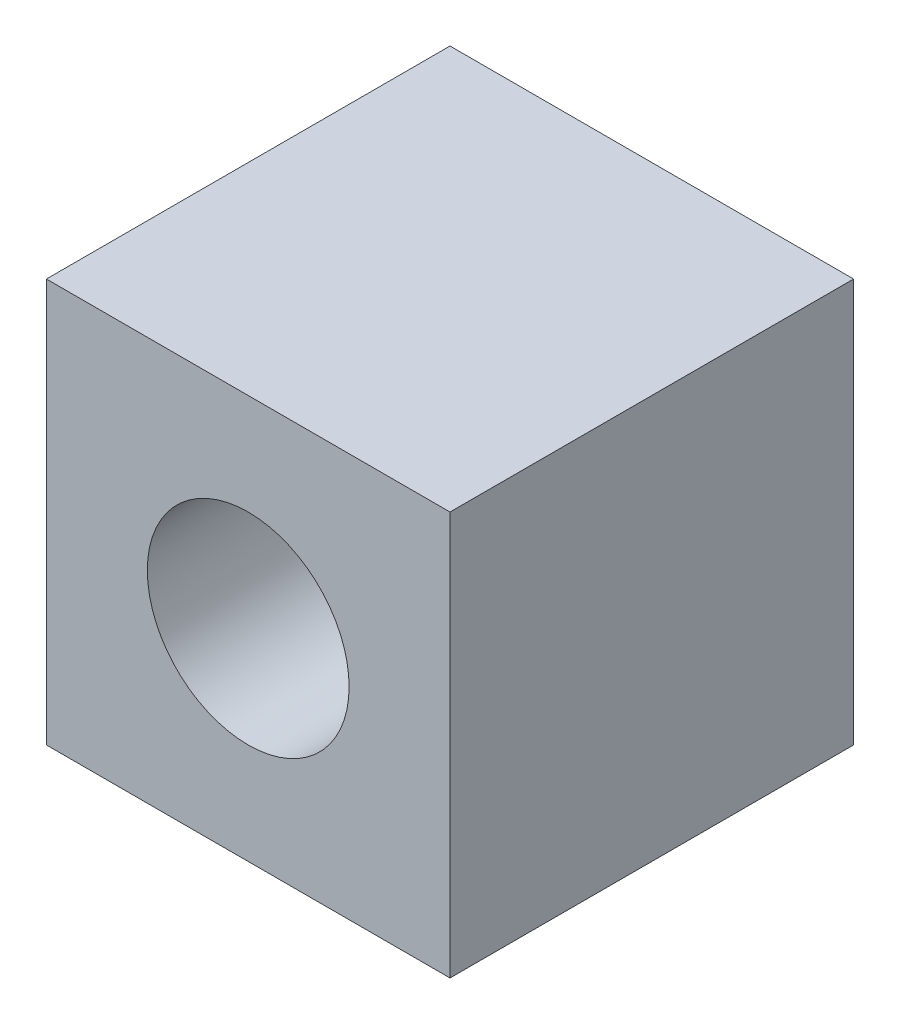
ISO-10303-21;
HEADER;
FILE_DESCRIPTION(('STEP AP214'),'2;1');
FILE_NAME('part.step','',(''),(''),'','','');
FILE_SCHEMA(('AUTOMOTIVE_DESIGN { 1 0 10303 214 1 1 1 1 }'));
ENDSEC;
DATA;
#1=APPLICATION_CONTEXT('core data for automotive mechanical design processes');
#2=APPLICATION_PROTOCOL_DEFINITION('international standard','automotive_design',2000,#1);
#3=PRODUCT_CONTEXT('',#1,'mechanical');
#4=PRODUCT('Part','Part','',(#3));
#5=PRODUCT_RELATED_PRODUCT_CATEGORY('part','',(#4));
#6=PRODUCT_DEFINITION_FORMATION('','',#4);
#7=PRODUCT_DEFINITION_CONTEXT('part definition',#1,'design');
#8=PRODUCT_DEFINITION('design','',#6,#7);
#9=PRODUCT_DEFINITION_SHAPE('','',#8);
#10=(LENGTH_UNIT() NAMED_UNIT(*) SI_UNIT(.MILLI.,.METRE.));
#11=(NAMED_UNIT(*) PLANE_ANGLE_UNIT() SI_UNIT($,.RADIAN.));
#12=(NAMED_UNIT(*) SI_UNIT($,.STERADIAN.) SOLID_ANGLE_UNIT());
#13=UNCERTAINTY_MEASURE_WITH_UNIT(LENGTH_MEASURE(1.E-05),#10,'distance_accuracy_value','');
#14=(GEOMETRIC_REPRESENTATION_CONTEXT(3) GLOBAL_UNCERTAINTY_ASSIGNED_CONTEXT((#13)) GLOBAL_UNIT_ASSIGNED_CONTEXT((#10,
#11,#12)) REPRESENTATION_CONTEXT('',''));
#15=CARTESIAN_POINT('',(0.,0.,0.));
#16=DIRECTION('',(0.,0.,1.));
#17=DIRECTION('',(1.,0.,0.));
#18=AXIS2_PLACEMENT_3D('',#15,#16,#17);
#19=CARTESIAN_POINT('',(-50.,100.,50.));
#20=DIRECTION('',(1.,0.,0.));
#21=DIRECTION('',(0.,0.,-1.));
#22=AXIS2_PLACEMENT_3D('',#19,#20,#21);
#23=PLANE('',#22);
#24=DIRECTION('',(0.,0.,1.));
#25=VECTOR('',#24,1.);
#26=CARTESIAN_POINT('',(-50.,0.,50.));
#27=LINE('',#26,#25);
#28=CARTESIAN_POINT('',(-50.,0.,-50.));
#29=VERTEX_POINT('',#28);
#30=CARTESIAN_POINT('',(-50.,0.,50.));
#31=VERTEX_POINT('',#30);
#32=EDGE_CURVE('E109',#29,#31,#27,.T.);
#33=ORIENTED_EDGE('',*,*,#32,.T.);
#34=DIRECTION('',(0.,-1.,0.));
#35=VECTOR('',#34,1.);
#36=CARTESIAN_POINT('',(-50.,100.,50.));
#37=LINE('',#36,#35);
#38=CARTESIAN_POINT('',(-50.,100.,50.));
#39=VERTEX_POINT('',#38);
#40=EDGE_CURVE('E11',#39,#31,#37,.T.);
#41=ORIENTED_EDGE('',*,*,#40,.F.);
#42=DIRECTION('',(0.,0.,1.));
#43=VECTOR('',#42,1.);
#44=CARTESIAN_POINT('',(-50.,100.,50.));
#45=LINE('',#44,#43);
#46=CARTESIAN_POINT('',(-50.,100.,-50.));
#47=VERTEX_POINT('',#46);
#48=EDGE_CURVE('E93',#47,#39,#45,.T.);
#49=ORIENTED_EDGE('',*,*,#48,.F.);
#50=DIRECTION('',(0.,-1.,0.));
#51=VECTOR('',#50,1.);
#52=CARTESIAN_POINT('',(-50.,100.,-50.));
#53=LINE('',#52,#51);
#54=EDGE_CURVE('E105',#47,#29,#53,.T.);
#55=ORIENTED_EDGE('',*,*,#54,.T.);
#56=EDGE_LOOP('',(#33,#41,#49,#55));
#57=FACE_BOUND('',#56,.T.);
#58=ADVANCED_FACE('F41',(#57),#23,.F.);
#59=CARTESIAN_POINT('',(50.,100.,50.));
#60=DIRECTION('',(0.,0.,-1.));
#61=DIRECTION('',(-1.,0.,0.));
#62=AXIS2_PLACEMENT_3D('',#59,#60,#61);
#63=PLANE('',#62);
#64=CARTESIAN_POINT('',(0.,50.,50.));
#65=DIRECTION('',(0.,0.,1.));
#66=DIRECTION('',(1.,0.,0.));
#67=AXIS2_PLACEMENT_3D('',#64,#65,#66);
#68=CIRCLE('',#67,25.);
#69=CARTESIAN_POINT('',(25.,50.,50.));
#70=VERTEX_POINT('',#69);
#71=EDGE_CURVE('E130',#70,#70,#68,.T.);
#72=ORIENTED_EDGE('',*,*,#71,.F.);
#73=EDGE_LOOP('',(#72));
#74=FACE_BOUND('',#73,.T.);
#75=DIRECTION('',(1.,0.,0.));
#76=VECTOR('',#75,1.);
#77=CARTESIAN_POINT('',(50.,0.,50.));
#78=LINE('',#77,#76);
#79=CARTESIAN_POINT('',(50.,0.,50.));
#80=VERTEX_POINT('',#79);
#81=EDGE_CURVE('E98',#31,#80,#78,.T.);
#82=ORIENTED_EDGE('',*,*,#81,.T.);
#83=DIRECTION('',(0.,-1.,0.));
#84=VECTOR('',#83,1.);
#85=CARTESIAN_POINT('',(50.,100.,50.));
#86=LINE('',#85,#84);
#87=CARTESIAN_POINT('',(50.,100.,50.));
#88=VERTEX_POINT('',#87);
#89=EDGE_CURVE('E50',#88,#80,#86,.T.);
#90=ORIENTED_EDGE('',*,*,#89,.F.);
#91=DIRECTION('',(1.,0.,0.));
#92=VECTOR('',#91,1.);
#93=CARTESIAN_POINT('',(50.,100.,50.));
#94=LINE('',#93,#92);
#95=EDGE_CURVE('E88',#39,#88,#94,.T.);
#96=ORIENTED_EDGE('',*,*,#95,.F.);
#97=ORIENTED_EDGE('',*,*,#40,.T.);
#98=EDGE_LOOP('',(#82,#90,#96,#97));
#99=FACE_BOUND('',#98,.T.);
#100=ADVANCED_FACE('F97',(#74,#99),#63,.F.);
#101=CARTESIAN_POINT('',(50.,100.,50.));
#102=DIRECTION('',(-1.,0.,0.));
#103=DIRECTION('',(0.,0.,1.));
#104=AXIS2_PLACEMENT_3D('',#101,#102,#103);
#105=PLANE('',#104);
#106=DIRECTION('',(0.,0.,-1.));
#107=VECTOR('',#106,1.);
#108=CARTESIAN_POINT('',(50.,0.,50.));
#109=LINE('',#108,#107);
#110=CARTESIAN_POINT('',(50.,0.,-50.));
#111=VERTEX_POINT('',#110);
#112=EDGE_CURVE('E75',#80,#111,#109,.T.);
#113=ORIENTED_EDGE('',*,*,#112,.T.);
#114=DIRECTION('',(0.,-1.,0.));
#115=VECTOR('',#114,1.);
#116=CARTESIAN_POINT('',(50.,100.,-50.));
#117=LINE('',#116,#115);
#118=CARTESIAN_POINT('',(50.,100.,-50.));
#119=VERTEX_POINT('',#118);
#120=EDGE_CURVE('E100',#119,#111,#117,.T.);
#121=ORIENTED_EDGE('',*,*,#120,.F.);
#122=DIRECTION('',(0.,0.,-1.));
#123=VECTOR('',#122,1.);
#124=CARTESIAN_POINT('',(50.,100.,50.));
#125=LINE('',#124,#123);
#126=EDGE_CURVE('E91',#88,#119,#125,.T.);
#127=ORIENTED_EDGE('',*,*,#126,.F.);
#128=ORIENTED_EDGE('',*,*,#89,.T.);
#129=EDGE_LOOP('',(#113,#121,#127,#128));
#130=FACE_BOUND('',#129,.T.);
#131=ADVANCED_FACE('F101',(#130),#105,.F.);
#132=CARTESIAN_POINT('',(50.,100.,-50.));
#133=DIRECTION('',(0.,0.,1.));
#134=DIRECTION('',(1.,0.,0.));
#135=AXIS2_PLACEMENT_3D('',#132,#133,#134);
#136=PLANE('',#135);
#137=CARTESIAN_POINT('',(0.,50.,-50.));
#138=DIRECTION('',(0.,0.,1.));
#139=DIRECTION('',(1.,0.,0.));
#140=AXIS2_PLACEMENT_3D('',#137,#138,#139);
#141=CIRCLE('',#140,25.);
#142=CARTESIAN_POINT('',(25.,50.,-50.));
#143=VERTEX_POINT('',#142);
#144=EDGE_CURVE('E113',#143,#143,#141,.T.);
#145=ORIENTED_EDGE('',*,*,#144,.T.);
#146=EDGE_LOOP('',(#145));
#147=FACE_BOUND('',#146,.T.);
#148=DIRECTION('',(-1.,0.,0.));
#149=VECTOR('',#148,1.);
#150=CARTESIAN_POINT('',(50.,0.,-50.));
#151=LINE('',#150,#149);
#152=EDGE_CURVE('E81',#111,#29,#151,.T.);
#153=ORIENTED_EDGE('',*,*,#152,.T.);
#154=ORIENTED_EDGE('',*,*,#54,.F.);
#155=DIRECTION('',(-1.,0.,0.));
#156=VECTOR('',#155,1.);
#157=CARTESIAN_POINT('',(50.,100.,-50.));
#158=LINE('',#157,#156);
#159=EDGE_CURVE('E58',#119,#47,#158,.T.);
#160=ORIENTED_EDGE('',*,*,#159,.F.);
#161=ORIENTED_EDGE('',*,*,#120,.T.);
#162=EDGE_LOOP('',(#153,#154,#160,#161));
#163=FACE_BOUND('',#162,.T.);
#164=ADVANCED_FACE('F123',(#147,#163),#136,.F.);
#165=CARTESIAN_POINT('',(0.,100.,0.));
#166=DIRECTION('',(0.,1.,0.));
#167=DIRECTION('',(0.,0.,1.));
#168=AXIS2_PLACEMENT_3D('',#165,#166,#167);
#169=PLANE('',#168);
#170=ORIENTED_EDGE('',*,*,#48,.T.);
#171=ORIENTED_EDGE('',*,*,#95,.T.);
#172=ORIENTED_EDGE('',*,*,#126,.T.);
#173=ORIENTED_EDGE('',*,*,#159,.T.);
#174=EDGE_LOOP('',(#170,#171,#172,#173));
#175=FACE_BOUND('',#174,.T.);
#176=ADVANCED_FACE('F89',(#175),#169,.T.);
#177=CARTESIAN_POINT('',(0.,0.,0.));
#178=DIRECTION('',(0.,1.,0.));
#179=DIRECTION('',(0.,0.,1.));
#180=AXIS2_PLACEMENT_3D('',#177,#178,#179);
#181=PLANE('',#180);
#182=ORIENTED_EDGE('',*,*,#32,.F.);
#183=ORIENTED_EDGE('',*,*,#152,.F.);
#184=ORIENTED_EDGE('',*,*,#112,.F.);
#185=ORIENTED_EDGE('',*,*,#81,.F.);
#186=EDGE_LOOP('',(#182,#183,#184,#185));
#187=FACE_BOUND('',#186,.T.);
#188=ADVANCED_FACE('F126',(#187),#181,.F.);
#189=CARTESIAN_POINT('',(0.,50.,-50.));
#190=DIRECTION('',(0.,0.,1.));
#191=DIRECTION('',(1.,0.,0.));
#192=AXIS2_PLACEMENT_3D('',#189,#190,#191);
#193=CYLINDRICAL_SURFACE('',#192,25.);
#194=ORIENTED_EDGE('',*,*,#144,.F.);
#195=EDGE_LOOP('',(#194));
#196=FACE_BOUND('',#195,.T.);
#197=ORIENTED_EDGE('',*,*,#71,.T.);
#198=EDGE_LOOP('',(#197));
#199=FACE_BOUND('',#198,.T.);
#200=ADVANCED_FACE('F139',(#196,#199),#193,.F.);
#201=CLOSED_SHELL('',(#58,#100,#131,#164,#176,#188,#200));
#202=MANIFOLD_SOLID_BREP('B2',#201);
#203=ADVANCED_BREP_SHAPE_REPRESENTATION('',(#18,#202),#14);
#204=SHAPE_DEFINITION_REPRESENTATION(#9,#203);
ENDSEC;
END-ISO-10303-21;
